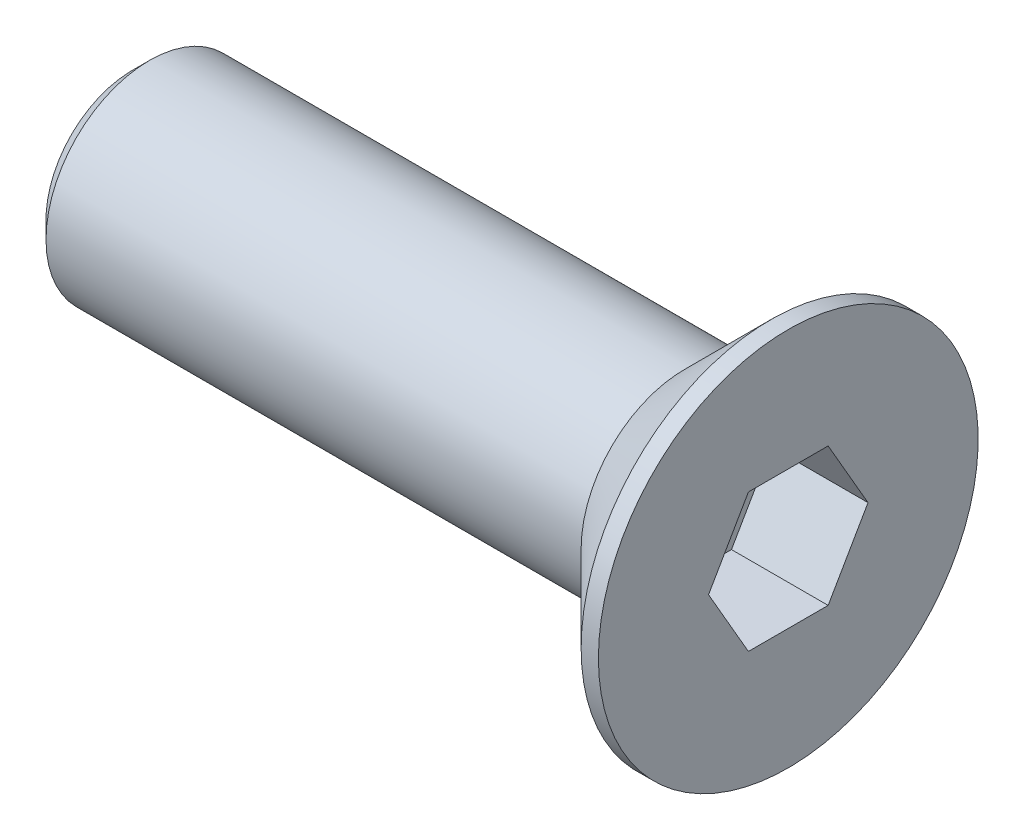
ISO-10303-21;
HEADER;
FILE_DESCRIPTION(('STEP AP214'),'2;1');
FILE_NAME('part.step','',(''),(''),'','','');
FILE_SCHEMA(('AUTOMOTIVE_DESIGN { 1 0 10303 214 1 1 1 1 }'));
ENDSEC;
DATA;
#1=APPLICATION_CONTEXT('core data for automotive mechanical design processes');
#2=APPLICATION_PROTOCOL_DEFINITION('international standard','automotive_design',2000,#1);
#3=PRODUCT_CONTEXT('',#1,'mechanical');
#4=PRODUCT('Part','Part','',(#3));
#5=PRODUCT_RELATED_PRODUCT_CATEGORY('part','',(#4));
#6=PRODUCT_DEFINITION_FORMATION('','',#4);
#7=PRODUCT_DEFINITION_CONTEXT('part definition',#1,'design');
#8=PRODUCT_DEFINITION('design','',#6,#7);
#9=PRODUCT_DEFINITION_SHAPE('','',#8);
#10=(LENGTH_UNIT() NAMED_UNIT(*) SI_UNIT(.MILLI.,.METRE.));
#11=(NAMED_UNIT(*) PLANE_ANGLE_UNIT() SI_UNIT($,.RADIAN.));
#12=(NAMED_UNIT(*) SI_UNIT($,.STERADIAN.) SOLID_ANGLE_UNIT());
#13=UNCERTAINTY_MEASURE_WITH_UNIT(LENGTH_MEASURE(1.E-05),#10,'distance_accuracy_value','');
#14=(GEOMETRIC_REPRESENTATION_CONTEXT(3) GLOBAL_UNCERTAINTY_ASSIGNED_CONTEXT((#13)) GLOBAL_UNIT_ASSIGNED_CONTEXT((#10,
#11,#12)) REPRESENTATION_CONTEXT('',''));
#15=CARTESIAN_POINT('',(0.,0.,0.));
#16=DIRECTION('',(0.,0.,1.));
#17=DIRECTION('',(1.,0.,0.));
#18=AXIS2_PLACEMENT_3D('',#15,#16,#17);
#19=CARTESIAN_POINT('',(0.,0.,0.));
#20=DIRECTION('',(1.,0.,0.));
#21=DIRECTION('',(0.,0.,-1.));
#22=AXIS2_PLACEMENT_3D('',#19,#20,#21);
#23=PLANE('',#22);
#24=CARTESIAN_POINT('',(0.,0.,0.));
#25=DIRECTION('',(1.,0.,0.));
#26=DIRECTION('',(0.,0.,-1.));
#27=AXIS2_PLACEMENT_3D('',#24,#25,#26);
#28=CIRCLE('',#27,2.5);
#29=CARTESIAN_POINT('',(0.,0.,-2.5));
#30=VERTEX_POINT('',#29);
#31=EDGE_CURVE('E41',#30,#30,#28,.F.);
#32=ORIENTED_EDGE('',*,*,#31,.T.);
#33=EDGE_LOOP('',(#32));
#34=FACE_BOUND('',#33,.T.);
#35=ADVANCED_FACE('F34',(#34),#23,.F.);
#36=CARTESIAN_POINT('',(-25.8284750337382,0.,0.));
#37=DIRECTION('',(-1.,0.,0.));
#38=DIRECTION('',(0.,0.,1.));
#39=AXIS2_PLACEMENT_3D('',#36,#37,#38);
#40=CYLINDRICAL_SURFACE('',#39,3.);
#41=CARTESIAN_POINT('',(0.5,0.,0.));
#42=DIRECTION('',(1.,0.,0.));
#43=DIRECTION('',(0.,0.,-1.));
#44=AXIS2_PLACEMENT_3D('',#41,#42,#43);
#45=CIRCLE('',#44,3.);
#46=CARTESIAN_POINT('',(0.5,0.,-3.));
#47=VERTEX_POINT('',#46);
#48=EDGE_CURVE('E12',#47,#47,#45,.T.);
#49=ORIENTED_EDGE('',*,*,#48,.T.);
#50=EDGE_LOOP('',(#49));
#51=FACE_BOUND('',#50,.T.);
#52=CARTESIAN_POINT('',(16.,0.,0.));
#53=DIRECTION('',(-1.,0.,0.));
#54=DIRECTION('',(0.,0.,1.));
#55=AXIS2_PLACEMENT_3D('',#52,#53,#54);
#56=CIRCLE('',#55,3.);
#57=CARTESIAN_POINT('',(16.,0.,3.));
#58=VERTEX_POINT('',#57);
#59=EDGE_CURVE('E148',#58,#58,#56,.T.);
#60=ORIENTED_EDGE('',*,*,#59,.T.);
#61=EDGE_LOOP('',(#60));
#62=FACE_BOUND('',#61,.T.);
#63=ADVANCED_FACE('F169',(#51,#62),#40,.T.);
#64=CARTESIAN_POINT('',(18.5,0.,0.));
#65=DIRECTION('',(1.,0.,0.));
#66=DIRECTION('',(0.,0.,-1.));
#67=AXIS2_PLACEMENT_3D('',#64,#65,#66);
#68=CONICAL_SURFACE('',#67,5.5,0.785398163397451);
#69=ORIENTED_EDGE('',*,*,#59,.F.);
#70=EDGE_LOOP('',(#69));
#71=FACE_BOUND('',#70,.T.);
#72=CARTESIAN_POINT('',(18.5,0.,0.));
#73=DIRECTION('',(-1.,0.,0.));
#74=DIRECTION('',(0.,0.,1.));
#75=AXIS2_PLACEMENT_3D('',#72,#73,#74);
#76=CIRCLE('',#75,5.5);
#77=CARTESIAN_POINT('',(18.5,0.,5.5));
#78=VERTEX_POINT('',#77);
#79=EDGE_CURVE('E145',#78,#78,#76,.T.);
#80=ORIENTED_EDGE('',*,*,#79,.T.);
#81=EDGE_LOOP('',(#80));
#82=FACE_BOUND('',#81,.T.);
#83=ADVANCED_FACE('F173',(#71,#82),#68,.T.);
#84=CARTESIAN_POINT('',(-25.8284750337382,0.,0.));
#85=DIRECTION('',(-1.,0.,0.));
#86=DIRECTION('',(0.,0.,1.));
#87=AXIS2_PLACEMENT_3D('',#84,#85,#86);
#88=CYLINDRICAL_SURFACE('',#87,5.5);
#89=ORIENTED_EDGE('',*,*,#79,.F.);
#90=EDGE_LOOP('',(#89));
#91=FACE_BOUND('',#90,.T.);
#92=CARTESIAN_POINT('',(19.,0.,0.));
#93=DIRECTION('',(-1.,0.,0.));
#94=DIRECTION('',(0.,0.,1.));
#95=AXIS2_PLACEMENT_3D('',#92,#93,#94);
#96=CIRCLE('',#95,5.5);
#97=CARTESIAN_POINT('',(19.,0.,5.5));
#98=VERTEX_POINT('',#97);
#99=EDGE_CURVE('E136',#98,#98,#96,.T.);
#100=ORIENTED_EDGE('',*,*,#99,.T.);
#101=EDGE_LOOP('',(#100));
#102=FACE_BOUND('',#101,.T.);
#103=ADVANCED_FACE('F165',(#91,#102),#88,.T.);
#104=CARTESIAN_POINT('',(19.,5.5,0.));
#105=DIRECTION('',(-1.,0.,0.));
#106=DIRECTION('',(0.,0.,1.));
#107=AXIS2_PLACEMENT_3D('',#104,#105,#106);
#108=PLANE('',#107);
#109=DIRECTION('',(0.,0.866025403784438,0.5));
#110=VECTOR('',#109,1.);
#111=CARTESIAN_POINT('',(19.,0.,-2.3094010767585));
#112=LINE('',#111,#110);
#113=CARTESIAN_POINT('',(19.,0.,-2.3094010767585));
#114=VERTEX_POINT('',#113);
#115=CARTESIAN_POINT('',(19.,2.,-1.15470053837925));
#116=VERTEX_POINT('',#115);
#117=EDGE_CURVE('E102',#114,#116,#112,.T.);
#118=ORIENTED_EDGE('',*,*,#117,.F.);
#119=DIRECTION('',(0.,0.866025403784439,-0.5));
#120=VECTOR('',#119,1.);
#121=CARTESIAN_POINT('',(19.,-2.,-1.15470053837925));
#122=LINE('',#121,#120);
#123=CARTESIAN_POINT('',(19.,-2.,-1.15470053837925));
#124=VERTEX_POINT('',#123);
#125=EDGE_CURVE('E48',#124,#114,#122,.T.);
#126=ORIENTED_EDGE('',*,*,#125,.F.);
#127=DIRECTION('',(0.,0.,-1.));
#128=VECTOR('',#127,1.);
#129=CARTESIAN_POINT('',(19.,-2.,1.15470053837925));
#130=LINE('',#129,#128);
#131=CARTESIAN_POINT('',(19.,-2.,1.15470053837925));
#132=VERTEX_POINT('',#131);
#133=EDGE_CURVE('E118',#132,#124,#130,.T.);
#134=ORIENTED_EDGE('',*,*,#133,.F.);
#135=DIRECTION('',(0.,-0.866025403784439,-0.5));
#136=VECTOR('',#135,1.);
#137=CARTESIAN_POINT('',(19.,0.,2.3094010767585));
#138=LINE('',#137,#136);
#139=CARTESIAN_POINT('',(19.,0.,2.3094010767585));
#140=VERTEX_POINT('',#139);
#141=EDGE_CURVE('E112',#140,#132,#138,.T.);
#142=ORIENTED_EDGE('',*,*,#141,.F.);
#143=DIRECTION('',(0.,-0.866025403784439,0.5));
#144=VECTOR('',#143,1.);
#145=CARTESIAN_POINT('',(19.,2.,1.15470053837925));
#146=LINE('',#145,#144);
#147=CARTESIAN_POINT('',(19.,2.,1.15470053837925));
#148=VERTEX_POINT('',#147);
#149=EDGE_CURVE('E110',#148,#140,#146,.T.);
#150=ORIENTED_EDGE('',*,*,#149,.F.);
#151=DIRECTION('',(0.,0.,1.));
#152=VECTOR('',#151,1.);
#153=CARTESIAN_POINT('',(19.,2.,-1.15470053837925));
#154=LINE('',#153,#152);
#155=EDGE_CURVE('E91',#116,#148,#154,.T.);
#156=ORIENTED_EDGE('',*,*,#155,.F.);
#157=EDGE_LOOP('',(#118,#126,#134,#142,#150,#156));
#158=FACE_BOUND('',#157,.T.);
#159=ORIENTED_EDGE('',*,*,#99,.F.);
#160=EDGE_LOOP('',(#159));
#161=FACE_BOUND('',#160,.T.);
#162=ADVANCED_FACE('F106',(#158,#161),#108,.F.);
#163=CARTESIAN_POINT('',(0.,0.,0.));
#164=DIRECTION('',(1.,0.,0.));
#165=DIRECTION('',(0.,0.,-1.));
#166=AXIS2_PLACEMENT_3D('',#163,#164,#165);
#167=CONICAL_SURFACE('',#166,2.5,0.785398163397447);
#168=ORIENTED_EDGE('',*,*,#48,.F.);
#169=EDGE_LOOP('',(#168));
#170=FACE_BOUND('',#169,.T.);
#171=ORIENTED_EDGE('',*,*,#31,.F.);
#172=EDGE_LOOP('',(#171));
#173=FACE_BOUND('',#172,.T.);
#174=ADVANCED_FACE('F154',(#170,#173),#167,.T.);
#175=CARTESIAN_POINT('',(16.2,-2.,-1.15470053837925));
#176=DIRECTION('',(0.,-0.5,-0.866025403784439));
#177=DIRECTION('',(0.,0.866025403784439,-0.5));
#178=AXIS2_PLACEMENT_3D('',#175,#176,#177);
#179=PLANE('',#178);
#180=ORIENTED_EDGE('',*,*,#125,.T.);
#181=DIRECTION('',(1.,0.,0.));
#182=VECTOR('',#181,1.);
#183=CARTESIAN_POINT('',(16.2,0.,-2.3094010767585));
#184=LINE('',#183,#182);
#185=CARTESIAN_POINT('',(16.2,0.,-2.3094010767585));
#186=VERTEX_POINT('',#185);
#187=EDGE_CURVE('E99',#186,#114,#184,.T.);
#188=ORIENTED_EDGE('',*,*,#187,.F.);
#189=DIRECTION('',(0.,0.866025403784439,-0.5));
#190=VECTOR('',#189,1.);
#191=CARTESIAN_POINT('',(16.2,-2.,-1.15470053837925));
#192=LINE('',#191,#190);
#193=CARTESIAN_POINT('',(16.2,-2.,-1.15470053837925));
#194=VERTEX_POINT('',#193);
#195=EDGE_CURVE('E120',#194,#186,#192,.T.);
#196=ORIENTED_EDGE('',*,*,#195,.F.);
#197=DIRECTION('',(1.,0.,0.));
#198=VECTOR('',#197,1.);
#199=CARTESIAN_POINT('',(16.2,-2.,-1.15470053837925));
#200=LINE('',#199,#198);
#201=EDGE_CURVE('E55',#194,#124,#200,.T.);
#202=ORIENTED_EDGE('',*,*,#201,.T.);
#203=EDGE_LOOP('',(#180,#188,#196,#202));
#204=FACE_BOUND('',#203,.T.);
#205=ADVANCED_FACE('F156',(#204),#179,.F.);
#206=CARTESIAN_POINT('',(16.2,-2.,1.15470053837925));
#207=DIRECTION('',(0.,-1.,0.));
#208=DIRECTION('',(0.,0.,-1.));
#209=AXIS2_PLACEMENT_3D('',#206,#207,#208);
#210=PLANE('',#209);
#211=ORIENTED_EDGE('',*,*,#133,.T.);
#212=ORIENTED_EDGE('',*,*,#201,.F.);
#213=DIRECTION('',(0.,0.,-1.));
#214=VECTOR('',#213,1.);
#215=CARTESIAN_POINT('',(16.2,-2.,1.15470053837925));
#216=LINE('',#215,#214);
#217=CARTESIAN_POINT('',(16.2,-2.,1.15470053837925));
#218=VERTEX_POINT('',#217);
#219=EDGE_CURVE('E132',#218,#194,#216,.T.);
#220=ORIENTED_EDGE('',*,*,#219,.F.);
#221=DIRECTION('',(1.,0.,0.));
#222=VECTOR('',#221,1.);
#223=CARTESIAN_POINT('',(16.2,-2.,1.15470053837925));
#224=LINE('',#223,#222);
#225=EDGE_CURVE('E137',#218,#132,#224,.T.);
#226=ORIENTED_EDGE('',*,*,#225,.T.);
#227=EDGE_LOOP('',(#211,#212,#220,#226));
#228=FACE_BOUND('',#227,.T.);
#229=ADVANCED_FACE('F163',(#228),#210,.F.);
#230=CARTESIAN_POINT('',(16.2,0.,2.3094010767585));
#231=DIRECTION('',(0.,-0.5,0.866025403784439));
#232=DIRECTION('',(0.,-0.866025403784439,-0.5));
#233=AXIS2_PLACEMENT_3D('',#230,#231,#232);
#234=PLANE('',#233);
#235=ORIENTED_EDGE('',*,*,#141,.T.);
#236=ORIENTED_EDGE('',*,*,#225,.F.);
#237=DIRECTION('',(0.,-0.866025403784439,-0.5));
#238=VECTOR('',#237,1.);
#239=CARTESIAN_POINT('',(16.2,0.,2.3094010767585));
#240=LINE('',#239,#238);
#241=CARTESIAN_POINT('',(16.2,0.,2.3094010767585));
#242=VERTEX_POINT('',#241);
#243=EDGE_CURVE('E129',#242,#218,#240,.T.);
#244=ORIENTED_EDGE('',*,*,#243,.F.);
#245=DIRECTION('',(1.,0.,0.));
#246=VECTOR('',#245,1.);
#247=CARTESIAN_POINT('',(16.2,0.,2.3094010767585));
#248=LINE('',#247,#246);
#249=EDGE_CURVE('E139',#242,#140,#248,.T.);
#250=ORIENTED_EDGE('',*,*,#249,.T.);
#251=EDGE_LOOP('',(#235,#236,#244,#250));
#252=FACE_BOUND('',#251,.T.);
#253=ADVANCED_FACE('F213',(#252),#234,.F.);
#254=CARTESIAN_POINT('',(16.2,2.,1.15470053837925));
#255=DIRECTION('',(0.,0.5,0.866025403784438));
#256=DIRECTION('',(0.,-0.866025403784439,0.5));
#257=AXIS2_PLACEMENT_3D('',#254,#255,#256);
#258=PLANE('',#257);
#259=ORIENTED_EDGE('',*,*,#149,.T.);
#260=ORIENTED_EDGE('',*,*,#249,.F.);
#261=DIRECTION('',(0.,-0.866025403784439,0.5));
#262=VECTOR('',#261,1.);
#263=CARTESIAN_POINT('',(16.2,2.,1.15470053837925));
#264=LINE('',#263,#262);
#265=CARTESIAN_POINT('',(16.2,2.,1.15470053837925));
#266=VERTEX_POINT('',#265);
#267=EDGE_CURVE('E126',#266,#242,#264,.T.);
#268=ORIENTED_EDGE('',*,*,#267,.F.);
#269=DIRECTION('',(1.,0.,0.));
#270=VECTOR('',#269,1.);
#271=CARTESIAN_POINT('',(16.2,2.,1.15470053837925));
#272=LINE('',#271,#270);
#273=EDGE_CURVE('E98',#266,#148,#272,.T.);
#274=ORIENTED_EDGE('',*,*,#273,.T.);
#275=EDGE_LOOP('',(#259,#260,#268,#274));
#276=FACE_BOUND('',#275,.T.);
#277=ADVANCED_FACE('F222',(#276),#258,.F.);
#278=CARTESIAN_POINT('',(16.2,2.,-1.15470053837925));
#279=DIRECTION('',(0.,1.,0.));
#280=DIRECTION('',(0.,0.,1.));
#281=AXIS2_PLACEMENT_3D('',#278,#279,#280);
#282=PLANE('',#281);
#283=ORIENTED_EDGE('',*,*,#155,.T.);
#284=ORIENTED_EDGE('',*,*,#273,.F.);
#285=DIRECTION('',(0.,0.,1.));
#286=VECTOR('',#285,1.);
#287=CARTESIAN_POINT('',(16.2,2.,-1.15470053837925));
#288=LINE('',#287,#286);
#289=CARTESIAN_POINT('',(16.2,2.,-1.15470053837925));
#290=VERTEX_POINT('',#289);
#291=EDGE_CURVE('E94',#290,#266,#288,.T.);
#292=ORIENTED_EDGE('',*,*,#291,.F.);
#293=DIRECTION('',(1.,0.,0.));
#294=VECTOR('',#293,1.);
#295=CARTESIAN_POINT('',(16.2,2.,-1.15470053837925));
#296=LINE('',#295,#294);
#297=EDGE_CURVE('E87',#290,#116,#296,.T.);
#298=ORIENTED_EDGE('',*,*,#297,.T.);
#299=EDGE_LOOP('',(#283,#284,#292,#298));
#300=FACE_BOUND('',#299,.T.);
#301=ADVANCED_FACE('F89',(#300),#282,.F.);
#302=CARTESIAN_POINT('',(16.2,0.,-2.3094010767585));
#303=DIRECTION('',(0.,0.5,-0.866025403784438));
#304=DIRECTION('',(0.,0.866025403784438,0.5));
#305=AXIS2_PLACEMENT_3D('',#302,#303,#304);
#306=PLANE('',#305);
#307=ORIENTED_EDGE('',*,*,#117,.T.);
#308=ORIENTED_EDGE('',*,*,#297,.F.);
#309=DIRECTION('',(0.,0.866025403784438,0.5));
#310=VECTOR('',#309,1.);
#311=CARTESIAN_POINT('',(16.2,0.,-2.3094010767585));
#312=LINE('',#311,#310);
#313=EDGE_CURVE('E123',#186,#290,#312,.T.);
#314=ORIENTED_EDGE('',*,*,#313,.F.);
#315=ORIENTED_EDGE('',*,*,#187,.T.);
#316=EDGE_LOOP('',(#307,#308,#314,#315));
#317=FACE_BOUND('',#316,.T.);
#318=ADVANCED_FACE('F103',(#317),#306,.F.);
#319=CARTESIAN_POINT('',(16.2,-2.,-1.15470053837925));
#320=DIRECTION('',(-1.,0.,0.));
#321=DIRECTION('',(0.,0.,1.));
#322=AXIS2_PLACEMENT_3D('',#319,#320,#321);
#323=PLANE('',#322);
#324=ORIENTED_EDGE('',*,*,#195,.T.);
#325=ORIENTED_EDGE('',*,*,#313,.T.);
#326=ORIENTED_EDGE('',*,*,#291,.T.);
#327=ORIENTED_EDGE('',*,*,#267,.T.);
#328=ORIENTED_EDGE('',*,*,#243,.T.);
#329=ORIENTED_EDGE('',*,*,#219,.T.);
#330=EDGE_LOOP('',(#324,#325,#326,#327,#328,#329));
#331=FACE_BOUND('',#330,.T.);
#332=ADVANCED_FACE('F249',(#331),#323,.F.);
#333=CLOSED_SHELL('',(#35,#63,#83,#103,#162,#174,#205,#229,#253,#277,#301,#318,#332));
#334=MANIFOLD_SOLID_BREP('B2',#333);
#335=ADVANCED_BREP_SHAPE_REPRESENTATION('',(#18,#334),#14);
#336=SHAPE_DEFINITION_REPRESENTATION(#9,#335);
ENDSEC;
END-ISO-10303-21;
